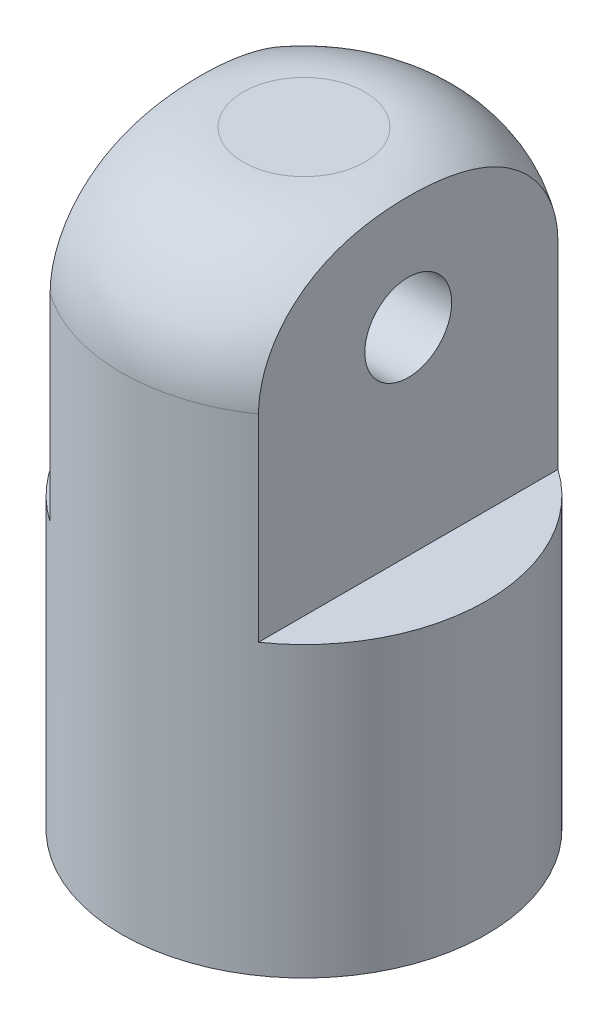
ISO-10303-21;
HEADER;
FILE_DESCRIPTION(('STEP AP214'),'2;1');
FILE_NAME('part.step','',(''),(''),'','','');
FILE_SCHEMA(('AUTOMOTIVE_DESIGN { 1 0 10303 214 1 1 1 1 }'));
ENDSEC;
DATA;
#1=APPLICATION_CONTEXT('core data for automotive mechanical design processes');
#2=APPLICATION_PROTOCOL_DEFINITION('international standard','automotive_design',2000,#1);
#3=PRODUCT_CONTEXT('',#1,'mechanical');
#4=PRODUCT('Part','Part','',(#3));
#5=PRODUCT_RELATED_PRODUCT_CATEGORY('part','',(#4));
#6=PRODUCT_DEFINITION_FORMATION('','',#4);
#7=PRODUCT_DEFINITION_CONTEXT('part definition',#1,'design');
#8=PRODUCT_DEFINITION('design','',#6,#7);
#9=PRODUCT_DEFINITION_SHAPE('','',#8);
#10=(LENGTH_UNIT() NAMED_UNIT(*) SI_UNIT(.MILLI.,.METRE.));
#11=(NAMED_UNIT(*) PLANE_ANGLE_UNIT() SI_UNIT($,.RADIAN.));
#12=(NAMED_UNIT(*) SI_UNIT($,.STERADIAN.) SOLID_ANGLE_UNIT());
#13=UNCERTAINTY_MEASURE_WITH_UNIT(LENGTH_MEASURE(1.E-05),#10,'distance_accuracy_value','');
#14=(GEOMETRIC_REPRESENTATION_CONTEXT(3) GLOBAL_UNCERTAINTY_ASSIGNED_CONTEXT((#13)) GLOBAL_UNIT_ASSIGNED_CONTEXT((#10,
#11,#12)) REPRESENTATION_CONTEXT('',''));
#15=CARTESIAN_POINT('',(0.,0.,0.));
#16=DIRECTION('',(0.,0.,1.));
#17=DIRECTION('',(1.,0.,0.));
#18=AXIS2_PLACEMENT_3D('',#15,#16,#17);
#19=CARTESIAN_POINT('',(0.,35.,0.));
#20=DIRECTION('',(0.,-1.,0.));
#21=DIRECTION('',(0.,0.,-1.));
#22=AXIS2_PLACEMENT_3D('',#19,#20,#21);
#23=CYLINDRICAL_SURFACE('',#22,10.5);
#24=CARTESIAN_POINT('',(0.,28.,0.));
#25=DIRECTION('',(0.,1.,0.));
#26=DIRECTION('',(0.,0.,1.));
#27=AXIS2_PLACEMENT_3D('',#24,#25,#26);
#28=CIRCLE('',#27,10.5);
#29=CARTESIAN_POINT('',(-6.,28.,-8.61684396980704));
#30=VERTEX_POINT('',#29);
#31=CARTESIAN_POINT('',(6.,28.,-8.61684396980704));
#32=VERTEX_POINT('',#31);
#33=EDGE_CURVE('E85',#30,#32,#28,.F.);
#34=ORIENTED_EDGE('',*,*,#33,.T.);
#35=DIRECTION('',(0.,-1.,0.));
#36=VECTOR('',#35,1.);
#37=CARTESIAN_POINT('',(6.,35.,-8.61684396980704));
#38=LINE('',#37,#36);
#39=CARTESIAN_POINT('',(6.,16.6235185130567,-8.61684396980704));
#40=VERTEX_POINT('',#39);
#41=EDGE_CURVE('E47',#32,#40,#38,.T.);
#42=ORIENTED_EDGE('',*,*,#41,.T.);
#43=CARTESIAN_POINT('',(0.,16.6235185130567,0.));
#44=DIRECTION('',(0.,-1.,0.));
#45=DIRECTION('',(0.,0.,-1.));
#46=AXIS2_PLACEMENT_3D('',#43,#44,#45);
#47=CIRCLE('',#46,10.5);
#48=CARTESIAN_POINT('',(6.,16.6235185130567,8.61684396980704));
#49=VERTEX_POINT('',#48);
#50=EDGE_CURVE('E11',#40,#49,#47,.T.);
#51=ORIENTED_EDGE('',*,*,#50,.T.);
#52=DIRECTION('',(0.,-1.,0.));
#53=VECTOR('',#52,1.);
#54=CARTESIAN_POINT('',(6.,35.,8.61684396980704));
#55=LINE('',#54,#53);
#56=CARTESIAN_POINT('',(6.,28.,8.61684396980704));
#57=VERTEX_POINT('',#56);
#58=EDGE_CURVE('E78',#49,#57,#55,.F.);
#59=ORIENTED_EDGE('',*,*,#58,.T.);
#60=CARTESIAN_POINT('',(-6.,28.,8.61684396980704));
#61=VERTEX_POINT('',#60);
#62=EDGE_CURVE('E55',#57,#61,#28,.F.);
#63=ORIENTED_EDGE('',*,*,#62,.T.);
#64=DIRECTION('',(0.,-1.,0.));
#65=VECTOR('',#64,1.);
#66=CARTESIAN_POINT('',(-6.,35.,8.61684396980704));
#67=LINE('',#66,#65);
#68=CARTESIAN_POINT('',(-6.,16.6235185130567,8.61684396980705));
#69=VERTEX_POINT('',#68);
#70=EDGE_CURVE('E94',#61,#69,#67,.T.);
#71=ORIENTED_EDGE('',*,*,#70,.T.);
#72=CARTESIAN_POINT('',(0.,16.6235185130567,0.));
#73=DIRECTION('',(0.,-1.,0.));
#74=DIRECTION('',(0.,0.,-1.));
#75=AXIS2_PLACEMENT_3D('',#72,#73,#74);
#76=CIRCLE('',#75,10.5);
#77=CARTESIAN_POINT('',(-6.,16.6235185130567,-8.61684396980705));
#78=VERTEX_POINT('',#77);
#79=EDGE_CURVE('E108',#69,#78,#76,.T.);
#80=ORIENTED_EDGE('',*,*,#79,.T.);
#81=DIRECTION('',(0.,-1.,0.));
#82=VECTOR('',#81,1.);
#83=CARTESIAN_POINT('',(-6.,35.,-8.61684396980704));
#84=LINE('',#83,#82);
#85=EDGE_CURVE('E89',#78,#30,#84,.F.);
#86=ORIENTED_EDGE('',*,*,#85,.T.);
#87=EDGE_LOOP('',(#34,#42,#51,#59,#63,#71,#80,#86));
#88=FACE_BOUND('',#87,.T.);
#89=CARTESIAN_POINT('',(0.,0.,0.));
#90=DIRECTION('',(0.,1.,0.));
#91=DIRECTION('',(0.,0.,1.));
#92=AXIS2_PLACEMENT_3D('',#89,#90,#91);
#93=CIRCLE('',#92,10.5);
#94=CARTESIAN_POINT('',(0.,0.,10.5));
#95=VERTEX_POINT('',#94);
#96=EDGE_CURVE('E96',#95,#95,#93,.T.);
#97=ORIENTED_EDGE('',*,*,#96,.T.);
#98=EDGE_LOOP('',(#97));
#99=FACE_BOUND('',#98,.T.);
#100=ADVANCED_FACE('F31',(#88,#99),#23,.T.);
#101=CARTESIAN_POINT('',(0.,35.,0.));
#102=DIRECTION('',(0.,1.,0.));
#103=DIRECTION('',(0.,0.,1.));
#104=AXIS2_PLACEMENT_3D('',#101,#102,#103);
#105=PLANE('',#104);
#106=CARTESIAN_POINT('',(0.,35.,0.));
#107=DIRECTION('',(0.,1.,0.));
#108=DIRECTION('',(0.,0.,1.));
#109=AXIS2_PLACEMENT_3D('',#106,#107,#108);
#110=CIRCLE('',#109,3.5);
#111=CARTESIAN_POINT('',(0.,35.,3.5));
#112=VERTEX_POINT('',#111);
#113=EDGE_CURVE('E99',#112,#112,#110,.T.);
#114=ORIENTED_EDGE('',*,*,#113,.T.);
#115=EDGE_LOOP('',(#114));
#116=FACE_BOUND('',#115,.T.);
#117=ADVANCED_FACE('F121',(#116),#105,.T.);
#118=CARTESIAN_POINT('',(0.,0.,0.));
#119=DIRECTION('',(0.,1.,0.));
#120=DIRECTION('',(0.,0.,1.));
#121=AXIS2_PLACEMENT_3D('',#118,#119,#120);
#122=PLANE('',#121);
#123=ORIENTED_EDGE('',*,*,#96,.F.);
#124=EDGE_LOOP('',(#123));
#125=FACE_BOUND('',#124,.T.);
#126=ADVANCED_FACE('F124',(#125),#122,.F.);
#127=CARTESIAN_POINT('',(0.,28.,0.));
#128=DIRECTION('',(0.,1.,0.));
#129=DIRECTION('',(0.,0.,1.));
#130=AXIS2_PLACEMENT_3D('',#127,#128,#129);
#131=DEGENERATE_TOROIDAL_SURFACE('',#130,3.5,7.,.T.);
#132=CARTESIAN_POINT('',(6.,34.538348415311,0.));
#133=CARTESIAN_POINT('',(6.,34.5383470476797,0.186580885059459));
#134=CARTESIAN_POINT('',(6.,34.535031612828,0.373158833971555));
#135=CARTESIAN_POINT('',(6.,34.5216316319683,0.746086476739765));
#136=CARTESIAN_POINT('',(6.,34.5115466426671,0.932436154847296));
#137=CARTESIAN_POINT('',(6.,34.4842105567304,1.30471851506696));
#138=CARTESIAN_POINT('',(6.,34.4669558593029,1.49065094038404));
#139=CARTESIAN_POINT('',(6.,34.4246868345988,1.86163039115523));
#140=CARTESIAN_POINT('',(6.,34.3996716059039,2.04667731121748));
#141=CARTESIAN_POINT('',(6.,34.3121171689303,2.59820711107407));
#142=CARTESIAN_POINT('',(6.,34.2369502966413,2.96289089226654));
#143=CARTESIAN_POINT('',(6.,34.0942460748687,3.50166123222229));
#144=CARTESIAN_POINT('',(6.,34.0417143056704,3.67980164502698));
#145=CARTESIAN_POINT('',(6.,33.9259403920513,4.03255459453971));
#146=CARTESIAN_POINT('',(6.,33.862700981253,4.20716801897197));
#147=CARTESIAN_POINT('',(6.,33.7210575357549,4.56150227960769));
#148=CARTESIAN_POINT('',(6.,33.6420045957356,4.74096509221903));
#149=CARTESIAN_POINT('',(6.,33.4707686597631,5.0935216820569));
#150=CARTESIAN_POINT('',(6.,33.3785867732366,5.26661599588293));
#151=CARTESIAN_POINT('',(6.,33.1808149449077,5.6049862297444));
#152=CARTESIAN_POINT('',(6.,33.0752255271332,5.77026245500043));
#153=CARTESIAN_POINT('',(6.,32.8506256537885,6.09145896378113));
#154=CARTESIAN_POINT('',(6.,32.7316150620613,6.24737915236483));
#155=CARTESIAN_POINT('',(6.,32.4795291168691,6.54937076951004));
#156=CARTESIAN_POINT('',(6.,32.3463574545955,6.69536201465493));
#157=CARTESIAN_POINT('',(6.,32.0672613694259,6.97459919050036));
#158=CARTESIAN_POINT('',(6.,31.9213381332272,7.10784630479359));
#159=CARTESIAN_POINT('',(6.,31.6176024616835,7.36003212125638));
#160=CARTESIAN_POINT('',(6.,31.4597904965536,7.47897138883793));
#161=CARTESIAN_POINT('',(6.,31.1334245575168,7.70106456192392));
#162=CARTESIAN_POINT('',(6.,30.9648717691818,7.80422020536423));
#163=CARTESIAN_POINT('',(6.,30.6353268964471,7.98419581299614));
#164=CARTESIAN_POINT('',(6.,30.4751998674173,8.06260286268284));
#165=CARTESIAN_POINT('',(6.,30.1485259550906,8.20463965566976));
#166=CARTESIAN_POINT('',(6.,29.9819796922651,8.26827082302393));
#167=CARTESIAN_POINT('',(6.,29.6438383276663,8.38003485170386));
#168=CARTESIAN_POINT('',(6.,29.4722453042928,8.42817399818534));
#169=CARTESIAN_POINT('',(6.,29.1253559364917,8.50844769539919));
#170=CARTESIAN_POINT('',(6.,28.9500597721605,8.54058302259241));
#171=CARTESIAN_POINT('',(6.,28.6103808292943,8.58670497948734));
#172=CARTESIAN_POINT('',(6.,28.4461561513686,8.60186375295892));
#173=CARTESIAN_POINT('',(6.,28.1169538077274,8.61801709991111));
#174=CARTESIAN_POINT('',(6.,27.9519759148595,8.61900707330178));
#175=CARTESIAN_POINT('',(6.,27.6226343232526,8.60680334136019));
#176=CARTESIAN_POINT('',(6.,27.4582703468047,8.59361710564905));
#177=CARTESIAN_POINT('',(6.,27.1312173604918,8.55319441432273));
#178=CARTESIAN_POINT('',(6.,26.9685289969287,8.52595273018649));
#179=CARTESIAN_POINT('',(6.,26.6491507057037,8.45833395627727));
#180=CARTESIAN_POINT('',(6.,26.4924055508438,8.41821719158695));
#181=CARTESIAN_POINT('',(6.,26.1827289011938,8.32507062346714));
#182=CARTESIAN_POINT('',(6.,26.0297990784365,8.27203526448678));
#183=CARTESIAN_POINT('',(6.,25.7288836376565,8.15356717093942));
#184=CARTESIAN_POINT('',(6.,25.5808963575713,8.0881386543009));
#185=CARTESIAN_POINT('',(6.,25.2907333848672,7.94545902538857));
#186=CARTESIAN_POINT('',(6.,25.1485579570097,7.86820737526568));
#187=CARTESIAN_POINT('',(6.,24.8677430296865,7.70070350576959));
#188=CARTESIAN_POINT('',(6.,24.7292543299059,7.61019858811677));
#189=CARTESIAN_POINT('',(6.,24.460048257379,7.41837927558068));
#190=CARTESIAN_POINT('',(6.,24.3293286481399,7.31706801522583));
#191=CARTESIAN_POINT('',(6.,24.0761783674013,7.10441586154709));
#192=CARTESIAN_POINT('',(6.,23.9537533527454,6.99306824174949));
#193=CARTESIAN_POINT('',(6.,23.7178312132029,6.76135482316139));
#194=CARTESIAN_POINT('',(6.,23.6043320035852,6.64099114308199));
#195=CARTESIAN_POINT('',(6.,23.3790072171889,6.38349474205575));
#196=CARTESIAN_POINT('',(6.,23.2678492541923,6.24577795638685));
#197=CARTESIAN_POINT('',(6.,23.056404149593,5.96225552149716));
#198=CARTESIAN_POINT('',(6.,22.9561172108438,5.81644972141191));
#199=CARTESIAN_POINT('',(6.,22.7665865204061,5.51804899194059));
#200=CARTESIAN_POINT('',(6.,22.677331724394,5.36546106374249));
#201=CARTESIAN_POINT('',(6.,22.5096294560222,5.0544467438311));
#202=CARTESIAN_POINT('',(6.,22.4311842585074,4.89601913203971));
#203=CARTESIAN_POINT('',(6.,22.2470827517565,4.49135225554522));
#204=CARTESIAN_POINT('',(6.,22.1482689622811,4.24198018357643));
#205=CARTESIAN_POINT('',(6.,21.973317032721,3.73540836880231));
#206=CARTESIAN_POINT('',(6.,21.8971889432407,3.47820521198973));
#207=CARTESIAN_POINT('',(6.,21.7650692762856,2.95711187155706));
#208=CARTESIAN_POINT('',(6.,21.7092005301741,2.69319094999168));
#209=CARTESIAN_POINT('',(6.,21.6157756459416,2.16218231670984));
#210=CARTESIAN_POINT('',(6.,21.5782197790966,1.89509455814178));
#211=CARTESIAN_POINT('',(6.,21.5258459395111,1.41990404679869));
#212=CARTESIAN_POINT('',(6.,21.5078045713599,1.21214299101859));
#213=CARTESIAN_POINT('',(6.,21.4805293061332,0.796021228875646));
#214=CARTESIAN_POINT('',(6.,21.471296471213,0.58766045323467));
#215=CARTESIAN_POINT('',(6.,21.4611813450314,0.170542649874067));
#216=CARTESIAN_POINT('',(6.,21.4603069968236,-0.0382145662395018));
#217=CARTESIAN_POINT('',(6.,21.4668838261679,-0.455587157397281));
#218=CARTESIAN_POINT('',(6.,21.4743345975712,-0.664202538864227));
#219=CARTESIAN_POINT('',(6.,21.4978890357739,-1.08011321487968));
#220=CARTESIAN_POINT('',(6.,21.5139573843598,-1.28741042746345));
#221=CARTESIAN_POINT('',(6.,21.5554420314481,-1.70104900547415));
#222=CARTESIAN_POINT('',(6.,21.5808589644067,-1.9073903050639));
#223=CARTESIAN_POINT('',(6.,21.6725371352318,-2.52359209093716));
#224=CARTESIAN_POINT('',(6.,21.7542642406613,-2.93144142922276));
#225=CARTESIAN_POINT('',(6.,21.9151149028473,-3.53609648618851));
#226=CARTESIAN_POINT('',(6.,21.9757020367475,-3.73792640747409));
#227=CARTESIAN_POINT('',(6.,22.1108166424432,-4.13691985229828));
#228=CARTESIAN_POINT('',(6.,22.1853438119163,-4.3340834769321));
#229=CARTESIAN_POINT('',(6.,22.3490557994567,-4.72193783996171));
#230=CARTESIAN_POINT('',(6.,22.4382203556282,-4.91263709253501));
#231=CARTESIAN_POINT('',(6.,22.631832639714,-5.2861502597584));
#232=CARTESIAN_POINT('',(6.,22.7362803463899,-5.46896418536599));
#233=CARTESIAN_POINT('',(6.,22.961826471654,-5.82667409655229));
#234=CARTESIAN_POINT('',(6.,23.0830842003962,-6.0014700265969));
#235=CARTESIAN_POINT('',(6.,23.3412735035322,-6.33912329973631));
#236=CARTESIAN_POINT('',(6.,23.4782056111503,-6.50198023637098));
#237=CARTESIAN_POINT('',(6.,23.7672377783909,-6.81376581028696));
#238=CARTESIAN_POINT('',(6.,23.9193430532273,-6.96268962425406));
#239=CARTESIAN_POINT('',(6.,24.2377236971245,-7.24453333540423));
#240=CARTESIAN_POINT('',(6.,24.4039969066427,-7.37745566418245));
#241=CARTESIAN_POINT('',(6.,24.7286540487555,-7.61054643765993));
#242=CARTESIAN_POINT('',(6.,24.8855933150901,-7.7127311870653));
#243=CARTESIAN_POINT('',(6.,25.2082786054022,-7.90208966608787));
#244=CARTESIAN_POINT('',(6.,25.3740236846807,-7.9892650016959));
#245=CARTESIAN_POINT('',(6.,25.7128894666211,-8.14752399707165));
#246=CARTESIAN_POINT('',(6.,25.8860049250296,-8.21861887851039));
#247=CARTESIAN_POINT('',(6.,26.2382391386186,-8.34393146739957));
#248=CARTESIAN_POINT('',(6.,26.4173574104796,-8.39815053001607));
#249=CARTESIAN_POINT('',(6.,26.7612576873963,-8.48435469222224));
#250=CARTESIAN_POINT('',(6.,26.9256114762003,-8.51805692316374));
#251=CARTESIAN_POINT('',(6.,27.2566257501583,-8.57102103121931));
#252=CARTESIAN_POINT('',(6.,27.423286079016,-8.59028388194618));
#253=CARTESIAN_POINT('',(6.,27.757615714351,-8.61417279716831));
#254=CARTESIAN_POINT('',(6.,27.9252847980595,-8.61880198242639));
#255=CARTESIAN_POINT('',(6.,28.2603869411644,-8.61338558185795));
#256=CARTESIAN_POINT('',(6.,28.4278200015056,-8.60334005494263));
#257=CARTESIAN_POINT('',(6.,28.7554737680412,-8.56926946656343));
#258=CARTESIAN_POINT('',(6.,28.9157455707131,-8.54573331727795));
#259=CARTESIAN_POINT('',(6.,29.2338007019116,-8.48527950070916));
#260=CARTESIAN_POINT('',(6.,29.3915831760014,-8.44835733878338));
#261=CARTESIAN_POINT('',(6.,29.7034405705524,-8.36149828180089));
#262=CARTESIAN_POINT('',(6.,29.8575172032367,-8.31156752842386));
#263=CARTESIAN_POINT('',(6.,30.1610799072176,-8.19911890776889));
#264=CARTESIAN_POINT('',(6.,30.3105639172999,-8.13659548120858));
#265=CARTESIAN_POINT('',(6.,30.6053433080639,-7.99887596099465));
#266=CARTESIAN_POINT('',(6.,30.7505839039593,-7.9235626796401));
#267=CARTESIAN_POINT('',(6.,31.0344605120356,-7.76137301227181));
#268=CARTESIAN_POINT('',(6.,31.1730962003182,-7.67449605997782));
#269=CARTESIAN_POINT('',(6.,31.4430013065236,-7.48993029520538));
#270=CARTESIAN_POINT('',(6.,31.5742694358294,-7.39223960018417));
#271=CARTESIAN_POINT('',(6.,31.828719807031,-7.1869200290056));
#272=CARTESIAN_POINT('',(6.,31.9519041289679,-7.07929372666559));
#273=CARTESIAN_POINT('',(6.,32.1959882850562,-6.84902419316991));
#274=CARTESIAN_POINT('',(6.,32.316422745229,-6.72588779539327));
#275=CARTESIAN_POINT('',(6.,32.5473244640053,-6.47061677134737));
#276=CARTESIAN_POINT('',(6.,32.6577916268258,-6.33848205862806));
#277=CARTESIAN_POINT('',(6.,32.868495321218,-6.06626506125714));
#278=CARTESIAN_POINT('',(6.,32.9687299477255,-5.92618130420092));
#279=CARTESIAN_POINT('',(6.,33.1588438174547,-5.63914411099166));
#280=CARTESIAN_POINT('',(6.,33.2487210660915,-5.4921893592824));
#281=CARTESIAN_POINT('',(6.,33.4523950045808,-5.13186861216753));
#282=CARTESIAN_POINT('',(6.,33.5611851465555,-4.91565848265422));
#283=CARTESIAN_POINT('',(6.,33.7590636548106,-4.47439981242773));
#284=CARTESIAN_POINT('',(6.,33.8481449367445,-4.24934812773683));
#285=CARTESIAN_POINT('',(6.,34.0078239412462,-3.79263557790706));
#286=CARTESIAN_POINT('',(6.,34.0784073084903,-3.5609697335372));
#287=CARTESIAN_POINT('',(6.,34.2025824148097,-3.09312433995413));
#288=CARTESIAN_POINT('',(6.,34.2561703832541,-2.85694380140861));
#289=CARTESIAN_POINT('',(6.,34.343773293085,-2.40405363199883));
#290=CARTESIAN_POINT('',(6.,34.3791557743447,-2.18760372642594));
#291=CARTESIAN_POINT('',(6.,34.4386942450028,-1.7532030285663));
#292=CARTESIAN_POINT('',(6.,34.4628512072191,-1.53525236799882));
#293=CARTESIAN_POINT('',(6.,34.5010733197104,-1.09797012762912));
#294=CARTESIAN_POINT('',(6.,34.5151146997011,-0.878636509068205));
#295=CARTESIAN_POINT('',(6.,34.5337539032118,-0.43953395003534));
#296=CARTESIAN_POINT('',(6.,34.5383500261802,-0.21976493830218));
#297=CARTESIAN_POINT('',(6.,34.538348415311,0.));
#298=B_SPLINE_CURVE_WITH_KNOTS('',3,(#132,#133,#134,#135,#136,#137,#138,#139,#140,#141,#142,
#143,#144,#145,#146,#147,#148,#149,#150,#151,#152,#153,#154,#155,#156,#157,#158,#159,#160,#161,
#162,#163,#164,#165,#166,#167,#168,#169,#170,#171,#172,#173,#174,#175,#176,#177,#178,#179,#180,
#181,#182,#183,#184,#185,#186,#187,#188,#189,#190,#191,#192,#193,#194,#195,#196,#197,#198,#199,
#200,#201,#202,#203,#204,#205,#206,#207,#208,#209,#210,#211,#212,#213,#214,#215,#216,#217,#218,
#219,#220,#221,#222,#223,#224,#225,#226,#227,#228,#229,#230,#231,#232,#233,#234,#235,#236,#237,
#238,#239,#240,#241,#242,#243,#244,#245,#246,#247,#248,#249,#250,#251,#252,#253,#254,#255,#256,
#257,#258,#259,#260,#261,#262,#263,#264,#265,#266,#267,#268,#269,#270,#271,#272,#273,#274,#275,
#276,#277,#278,#279,#280,#281,#282,#283,#284,#285,#286,#287,#288,#289,#290,#291,#292,#293,#294,
#295,#296,#297),.UNSPECIFIED.,.T.,.F.,(4,2,2,2,2,2,2,2,2,2,2,2,2,2,2,2,2,2,2,2,2,2,2,2,2,2,2,2,
2,2,2,2,2,2,2,2,2,2,2,2,2,2,2,2,2,2,2,2,2,2,2,2,2,2,2,2,2,2,2,2,2,2,2,2,2,2,2,2,2,2,2,2,2,2,2,2,
2,2,2,2,2,2,4),(0.,0.559706185938889,1.11944902689943,1.67947332397216,2.23956269457168,
3.35431071351508,3.91121249417814,4.46797231359636,5.05577352272967,5.64352509071895,
6.23125369373545,6.81898825975655,7.41101224504284,8.00298119345879,8.5949267409835,
9.18680706236785,9.72098094549099,10.2551033251961,10.789008735993,11.3228882406583,
11.8170566442499,12.3113854825673,12.8054539804657,13.299706400779,13.7845360059541,
14.269574477944,14.7544481659833,15.2393439180913,15.7351139085981,16.2307404832583,
16.7267017376881,17.2225468081256,17.7529401535332,18.2833433943892,18.8132112700978,
19.3431904850355,20.1466088851244,20.9503827019036,21.7589513479829,22.5675319713522,
23.1929743279419,23.8184920924283,24.4446042262075,25.0706858158523,25.6942208695209,
26.3177982481811,27.5625259627722,28.1943011773291,28.8260626919381,29.4569569488496,
30.087850329038,30.7251935812002,31.3625585214914,32.0001432921712,32.6376310524609,
33.1986791423393,33.7596671633288,34.3202624851911,34.8808127783715,35.3835126368049,
35.8861785963417,36.3887373505373,36.8912940872312,37.3766955104566,37.8622600688555,
38.3475957942715,38.8331462521596,39.3234127215341,39.8137032084055,40.3040791835993,
40.794328481554,41.310505704304,41.8266878868545,42.3429659961343,42.8593433627539,
43.5843435165198,44.309603849613,45.0354253660494,45.7614078021421,46.4190577426405,
47.0766506797022,47.7357838773152,48.3950357368023),.UNSPECIFIED.);
#299=EDGE_CURVE('E40',#32,#57,#298,.T.);
#300=ORIENTED_EDGE('',*,*,#299,.F.);
#301=ORIENTED_EDGE('',*,*,#33,.F.);
#302=CARTESIAN_POINT('',(-6.,34.538348415311,0.));
#303=CARTESIAN_POINT('',(-6.,34.5383470476797,-0.186580885059459));
#304=CARTESIAN_POINT('',(-6.,34.535031612828,-0.373158833971555));
#305=CARTESIAN_POINT('',(-6.,34.5216316319683,-0.746086476739765));
#306=CARTESIAN_POINT('',(-6.,34.5115466426671,-0.932436154847296));
#307=CARTESIAN_POINT('',(-6.,34.4842105567304,-1.30471851506696));
#308=CARTESIAN_POINT('',(-6.,34.4669558593029,-1.49065094038404));
#309=CARTESIAN_POINT('',(-6.,34.4246868345988,-1.86163039115523));
#310=CARTESIAN_POINT('',(-6.,34.3996716059039,-2.04667731121748));
#311=CARTESIAN_POINT('',(-6.,34.3121171689303,-2.59820711107407));
#312=CARTESIAN_POINT('',(-6.,34.2369502966413,-2.96289089226654));
#313=CARTESIAN_POINT('',(-6.,34.0942460748687,-3.50166123222229));
#314=CARTESIAN_POINT('',(-6.,34.0417143056704,-3.67980164502698));
#315=CARTESIAN_POINT('',(-6.,33.9259403920513,-4.03255459453971));
#316=CARTESIAN_POINT('',(-6.,33.862700981253,-4.20716801897197));
#317=CARTESIAN_POINT('',(-6.,33.7210575357549,-4.56150227960769));
#318=CARTESIAN_POINT('',(-6.,33.6420045957356,-4.74096509221903));
#319=CARTESIAN_POINT('',(-6.,33.4707686597631,-5.0935216820569));
#320=CARTESIAN_POINT('',(-6.,33.3785867732366,-5.26661599588293));
#321=CARTESIAN_POINT('',(-6.,33.1808149449077,-5.6049862297444));
#322=CARTESIAN_POINT('',(-6.,33.0752255271332,-5.77026245500043));
#323=CARTESIAN_POINT('',(-6.,32.8506256537885,-6.09145896378113));
#324=CARTESIAN_POINT('',(-6.,32.7316150620613,-6.24737915236483));
#325=CARTESIAN_POINT('',(-6.,32.4795291168691,-6.54937076951004));
#326=CARTESIAN_POINT('',(-6.,32.3463574545955,-6.69536201465493));
#327=CARTESIAN_POINT('',(-6.,32.0672613694259,-6.97459919050036));
#328=CARTESIAN_POINT('',(-6.,31.9213381332272,-7.10784630479359));
#329=CARTESIAN_POINT('',(-6.,31.6176024616835,-7.36003212125638));
#330=CARTESIAN_POINT('',(-6.,31.4597904965536,-7.47897138883793));
#331=CARTESIAN_POINT('',(-6.,31.1334245575168,-7.70106456192392));
#332=CARTESIAN_POINT('',(-6.,30.9648717691818,-7.80422020536423));
#333=CARTESIAN_POINT('',(-6.,30.6353268964471,-7.98419581299614));
#334=CARTESIAN_POINT('',(-6.,30.4751998674173,-8.06260286268284));
#335=CARTESIAN_POINT('',(-6.,30.1485259550906,-8.20463965566976));
#336=CARTESIAN_POINT('',(-6.,29.9819796922651,-8.26827082302393));
#337=CARTESIAN_POINT('',(-6.,29.6438383276663,-8.38003485170386));
#338=CARTESIAN_POINT('',(-6.,29.4722453042928,-8.42817399818534));
#339=CARTESIAN_POINT('',(-6.,29.1253559364917,-8.50844769539919));
#340=CARTESIAN_POINT('',(-6.,28.9500597721605,-8.54058302259241));
#341=CARTESIAN_POINT('',(-6.,28.6103808292943,-8.58670497948734));
#342=CARTESIAN_POINT('',(-6.,28.4461561513686,-8.60186375295892));
#343=CARTESIAN_POINT('',(-6.,28.1169538077274,-8.61801709991111));
#344=CARTESIAN_POINT('',(-6.,27.9519759148595,-8.61900707330178));
#345=CARTESIAN_POINT('',(-6.,27.6226343232526,-8.60680334136019));
#346=CARTESIAN_POINT('',(-6.,27.4582703468047,-8.59361710564905));
#347=CARTESIAN_POINT('',(-6.,27.1312173604918,-8.55319441432273));
#348=CARTESIAN_POINT('',(-6.,26.9685289969287,-8.52595273018649));
#349=CARTESIAN_POINT('',(-6.,26.6491507057037,-8.45833395627727));
#350=CARTESIAN_POINT('',(-6.,26.4924055508438,-8.41821719158695));
#351=CARTESIAN_POINT('',(-6.,26.1827289011938,-8.32507062346714));
#352=CARTESIAN_POINT('',(-6.,26.0297990784365,-8.27203526448678));
#353=CARTESIAN_POINT('',(-6.,25.7288836376565,-8.15356717093942));
#354=CARTESIAN_POINT('',(-6.,25.5808963575713,-8.0881386543009));
#355=CARTESIAN_POINT('',(-6.,25.2907333848672,-7.94545902538857));
#356=CARTESIAN_POINT('',(-6.,25.1485579570097,-7.86820737526568));
#357=CARTESIAN_POINT('',(-6.,24.8677430296865,-7.70070350576959));
#358=CARTESIAN_POINT('',(-6.,24.7292543299059,-7.61019858811677));
#359=CARTESIAN_POINT('',(-6.,24.460048257379,-7.41837927558068));
#360=CARTESIAN_POINT('',(-6.,24.3293286481399,-7.31706801522583));
#361=CARTESIAN_POINT('',(-6.,24.0761783674013,-7.10441586154709));
#362=CARTESIAN_POINT('',(-6.,23.9537533527454,-6.99306824174949));
#363=CARTESIAN_POINT('',(-6.,23.7178312132029,-6.76135482316139));
#364=CARTESIAN_POINT('',(-6.,23.6043320035852,-6.64099114308199));
#365=CARTESIAN_POINT('',(-6.,23.3790072171889,-6.38349474205575));
#366=CARTESIAN_POINT('',(-6.,23.2678492541923,-6.24577795638685));
#367=CARTESIAN_POINT('',(-6.,23.056404149593,-5.96225552149716));
#368=CARTESIAN_POINT('',(-6.,22.9561172108438,-5.81644972141191));
#369=CARTESIAN_POINT('',(-6.,22.7665865204061,-5.51804899194059));
#370=CARTESIAN_POINT('',(-6.,22.677331724394,-5.36546106374249));
#371=CARTESIAN_POINT('',(-6.,22.5096294560222,-5.0544467438311));
#372=CARTESIAN_POINT('',(-6.,22.4311842585074,-4.89601913203971));
#373=CARTESIAN_POINT('',(-6.,22.2470827517565,-4.49135225554522));
#374=CARTESIAN_POINT('',(-6.,22.1482689622811,-4.24198018357643));
#375=CARTESIAN_POINT('',(-6.,21.973317032721,-3.73540836880231));
#376=CARTESIAN_POINT('',(-6.,21.8971889432407,-3.47820521198973));
#377=CARTESIAN_POINT('',(-6.,21.7650692762856,-2.95711187155706));
#378=CARTESIAN_POINT('',(-6.,21.7092005301741,-2.69319094999168));
#379=CARTESIAN_POINT('',(-6.,21.6157756459416,-2.16218231670984));
#380=CARTESIAN_POINT('',(-6.,21.5782197790966,-1.89509455814178));
#381=CARTESIAN_POINT('',(-6.,21.5258459395111,-1.41990404679869));
#382=CARTESIAN_POINT('',(-6.,21.5078045713599,-1.21214299101859));
#383=CARTESIAN_POINT('',(-6.,21.4805293061332,-0.796021228875646));
#384=CARTESIAN_POINT('',(-6.,21.471296471213,-0.58766045323467));
#385=CARTESIAN_POINT('',(-6.,21.4611813450314,-0.170542649874067));
#386=CARTESIAN_POINT('',(-6.,21.4603069968236,0.0382145662395018));
#387=CARTESIAN_POINT('',(-6.,21.4668838261679,0.455587157397281));
#388=CARTESIAN_POINT('',(-6.,21.4743345975712,0.664202538864227));
#389=CARTESIAN_POINT('',(-6.,21.4978890357739,1.08011321487968));
#390=CARTESIAN_POINT('',(-6.,21.5139573843598,1.28741042746345));
#391=CARTESIAN_POINT('',(-6.,21.5554420314481,1.70104900547415));
#392=CARTESIAN_POINT('',(-6.,21.5808589644067,1.9073903050639));
#393=CARTESIAN_POINT('',(-6.,21.6725371352318,2.52359209093716));
#394=CARTESIAN_POINT('',(-6.,21.7542642406613,2.93144142922276));
#395=CARTESIAN_POINT('',(-6.,21.9151149028473,3.53609648618851));
#396=CARTESIAN_POINT('',(-6.,21.9757020367475,3.73792640747409));
#397=CARTESIAN_POINT('',(-6.,22.1108166424432,4.13691985229828));
#398=CARTESIAN_POINT('',(-6.,22.1853438119163,4.3340834769321));
#399=CARTESIAN_POINT('',(-6.,22.3490557994567,4.72193783996171));
#400=CARTESIAN_POINT('',(-6.,22.4382203556282,4.91263709253501));
#401=CARTESIAN_POINT('',(-6.,22.631832639714,5.2861502597584));
#402=CARTESIAN_POINT('',(-6.,22.7362803463899,5.46896418536599));
#403=CARTESIAN_POINT('',(-6.,22.961826471654,5.82667409655229));
#404=CARTESIAN_POINT('',(-6.,23.0830842003962,6.0014700265969));
#405=CARTESIAN_POINT('',(-6.,23.3412735035322,6.33912329973631));
#406=CARTESIAN_POINT('',(-6.,23.4782056111503,6.50198023637098));
#407=CARTESIAN_POINT('',(-6.,23.7672377783909,6.81376581028696));
#408=CARTESIAN_POINT('',(-6.,23.9193430532273,6.96268962425406));
#409=CARTESIAN_POINT('',(-6.,24.2377236971245,7.24453333540423));
#410=CARTESIAN_POINT('',(-6.,24.4039969066427,7.37745566418245));
#411=CARTESIAN_POINT('',(-6.,24.7286540487555,7.61054643765993));
#412=CARTESIAN_POINT('',(-6.,24.8855933150901,7.7127311870653));
#413=CARTESIAN_POINT('',(-6.,25.2082786054022,7.90208966608787));
#414=CARTESIAN_POINT('',(-6.,25.3740236846807,7.9892650016959));
#415=CARTESIAN_POINT('',(-6.,25.7128894666211,8.14752399707165));
#416=CARTESIAN_POINT('',(-6.,25.8860049250296,8.21861887851039));
#417=CARTESIAN_POINT('',(-6.,26.2382391386186,8.34393146739957));
#418=CARTESIAN_POINT('',(-6.,26.4173574104796,8.39815053001607));
#419=CARTESIAN_POINT('',(-6.,26.7612576873963,8.48435469222224));
#420=CARTESIAN_POINT('',(-6.,26.9256114762003,8.51805692316374));
#421=CARTESIAN_POINT('',(-6.,27.2566257501583,8.57102103121931));
#422=CARTESIAN_POINT('',(-6.,27.423286079016,8.59028388194618));
#423=CARTESIAN_POINT('',(-6.,27.757615714351,8.61417279716831));
#424=CARTESIAN_POINT('',(-6.,27.9252847980595,8.61880198242639));
#425=CARTESIAN_POINT('',(-6.,28.2603869411644,8.61338558185795));
#426=CARTESIAN_POINT('',(-6.,28.4278200015056,8.60334005494263));
#427=CARTESIAN_POINT('',(-6.,28.7554737680412,8.56926946656343));
#428=CARTESIAN_POINT('',(-6.,28.9157455707131,8.54573331727795));
#429=CARTESIAN_POINT('',(-6.,29.2338007019116,8.48527950070916));
#430=CARTESIAN_POINT('',(-6.,29.3915831760014,8.44835733878338));
#431=CARTESIAN_POINT('',(-6.,29.7034405705524,8.36149828180089));
#432=CARTESIAN_POINT('',(-6.,29.8575172032367,8.31156752842386));
#433=CARTESIAN_POINT('',(-6.,30.1610799072176,8.19911890776889));
#434=CARTESIAN_POINT('',(-6.,30.3105639172999,8.13659548120858));
#435=CARTESIAN_POINT('',(-6.,30.6053433080639,7.99887596099465));
#436=CARTESIAN_POINT('',(-6.,30.7505839039593,7.9235626796401));
#437=CARTESIAN_POINT('',(-6.,31.0344605120356,7.76137301227181));
#438=CARTESIAN_POINT('',(-6.,31.1730962003182,7.67449605997782));
#439=CARTESIAN_POINT('',(-6.,31.4430013065236,7.48993029520538));
#440=CARTESIAN_POINT('',(-6.,31.5742694358294,7.39223960018417));
#441=CARTESIAN_POINT('',(-6.,31.828719807031,7.1869200290056));
#442=CARTESIAN_POINT('',(-6.,31.9519041289679,7.07929372666559));
#443=CARTESIAN_POINT('',(-6.,32.1959882850562,6.84902419316991));
#444=CARTESIAN_POINT('',(-6.,32.316422745229,6.72588779539327));
#445=CARTESIAN_POINT('',(-6.,32.5473244640053,6.47061677134737));
#446=CARTESIAN_POINT('',(-6.,32.6577916268258,6.33848205862806));
#447=CARTESIAN_POINT('',(-6.,32.868495321218,6.06626506125714));
#448=CARTESIAN_POINT('',(-6.,32.9687299477255,5.92618130420092));
#449=CARTESIAN_POINT('',(-6.,33.1588438174547,5.63914411099166));
#450=CARTESIAN_POINT('',(-6.,33.2487210660915,5.4921893592824));
#451=CARTESIAN_POINT('',(-6.,33.4523950045808,5.13186861216753));
#452=CARTESIAN_POINT('',(-6.,33.5611851465555,4.91565848265422));
#453=CARTESIAN_POINT('',(-6.,33.7590636548106,4.47439981242773));
#454=CARTESIAN_POINT('',(-6.,33.8481449367445,4.24934812773683));
#455=CARTESIAN_POINT('',(-6.,34.0078239412462,3.79263557790706));
#456=CARTESIAN_POINT('',(-6.,34.0784073084903,3.5609697335372));
#457=CARTESIAN_POINT('',(-6.,34.2025824148097,3.09312433995413));
#458=CARTESIAN_POINT('',(-6.,34.2561703832541,2.85694380140861));
#459=CARTESIAN_POINT('',(-6.,34.343773293085,2.40405363199883));
#460=CARTESIAN_POINT('',(-6.,34.3791557743447,2.18760372642594));
#461=CARTESIAN_POINT('',(-6.,34.4386942450028,1.7532030285663));
#462=CARTESIAN_POINT('',(-6.,34.4628512072191,1.53525236799882));
#463=CARTESIAN_POINT('',(-6.,34.5010733197104,1.09797012762912));
#464=CARTESIAN_POINT('',(-6.,34.5151146997011,0.878636509068205));
#465=CARTESIAN_POINT('',(-6.,34.5337539032118,0.43953395003534));
#466=CARTESIAN_POINT('',(-6.,34.5383500261802,0.21976493830218));
#467=CARTESIAN_POINT('',(-6.,34.538348415311,0.));
#468=B_SPLINE_CURVE_WITH_KNOTS('',3,(#302,#303,#304,#305,#306,#307,#308,#309,#310,#311,#312,
#313,#314,#315,#316,#317,#318,#319,#320,#321,#322,#323,#324,#325,#326,#327,#328,#329,#330,#331,
#332,#333,#334,#335,#336,#337,#338,#339,#340,#341,#342,#343,#344,#345,#346,#347,#348,#349,#350,
#351,#352,#353,#354,#355,#356,#357,#358,#359,#360,#361,#362,#363,#364,#365,#366,#367,#368,#369,
#370,#371,#372,#373,#374,#375,#376,#377,#378,#379,#380,#381,#382,#383,#384,#385,#386,#387,#388,
#389,#390,#391,#392,#393,#394,#395,#396,#397,#398,#399,#400,#401,#402,#403,#404,#405,#406,#407,
#408,#409,#410,#411,#412,#413,#414,#415,#416,#417,#418,#419,#420,#421,#422,#423,#424,#425,#426,
#427,#428,#429,#430,#431,#432,#433,#434,#435,#436,#437,#438,#439,#440,#441,#442,#443,#444,#445,
#446,#447,#448,#449,#450,#451,#452,#453,#454,#455,#456,#457,#458,#459,#460,#461,#462,#463,#464,
#465,#466,#467),.UNSPECIFIED.,.T.,.F.,(4,2,2,2,2,2,2,2,2,2,2,2,2,2,2,2,2,2,2,2,2,2,2,2,2,2,2,2,
2,2,2,2,2,2,2,2,2,2,2,2,2,2,2,2,2,2,2,2,2,2,2,2,2,2,2,2,2,2,2,2,2,2,2,2,2,2,2,2,2,2,2,2,2,2,2,2,
2,2,2,2,2,2,4),(0.,0.559706185938889,1.11944902689943,1.67947332397216,2.23956269457168,
3.35431071351508,3.91121249417814,4.46797231359636,5.05577352272967,5.64352509071895,
6.23125369373545,6.81898825975655,7.41101224504284,8.00298119345879,8.5949267409835,
9.18680706236785,9.72098094549099,10.2551033251961,10.789008735993,11.3228882406583,
11.8170566442499,12.3113854825673,12.8054539804657,13.299706400779,13.7845360059541,
14.269574477944,14.7544481659833,15.2393439180913,15.7351139085981,16.2307404832583,
16.7267017376881,17.2225468081256,17.7529401535332,18.2833433943892,18.8132112700978,
19.3431904850355,20.1466088851244,20.9503827019036,21.7589513479829,22.5675319713522,
23.1929743279419,23.8184920924283,24.4446042262075,25.0706858158523,25.6942208695209,
26.3177982481811,27.5625259627722,28.1943011773291,28.8260626919381,29.4569569488496,
30.087850329038,30.7251935812002,31.3625585214914,32.0001432921712,32.6376310524609,
33.1986791423393,33.7596671633288,34.3202624851911,34.8808127783715,35.3835126368049,
35.8861785963417,36.3887373505373,36.8912940872312,37.3766955104566,37.8622600688555,
38.3475957942715,38.8331462521596,39.3234127215341,39.8137032084055,40.3040791835993,
40.794328481554,41.310505704304,41.8266878868545,42.3429659961343,42.8593433627539,
43.5843435165198,44.309603849613,45.0354253660494,45.7614078021421,46.4190577426405,
47.0766506797022,47.7357838773152,48.3950357368023),.UNSPECIFIED.);
#469=EDGE_CURVE('E103',#61,#30,#468,.T.);
#470=ORIENTED_EDGE('',*,*,#469,.F.);
#471=ORIENTED_EDGE('',*,*,#62,.F.);
#472=EDGE_LOOP('',(#300,#301,#470,#471));
#473=FACE_BOUND('',#472,.T.);
#474=ORIENTED_EDGE('',*,*,#113,.F.);
#475=EDGE_LOOP('',(#474));
#476=FACE_BOUND('',#475,.T.);
#477=ADVANCED_FACE('F33',(#473,#476),#131,.T.);
#478=CARTESIAN_POINT('',(-13.9585847523861,16.6235185130567,-20.));
#479=DIRECTION('',(0.,-1.,0.));
#480=DIRECTION('',(0.,0.,-1.));
#481=AXIS2_PLACEMENT_3D('',#478,#479,#480);
#482=PLANE('',#481);
#483=DIRECTION('',(0.,0.,1.));
#484=VECTOR('',#483,1.);
#485=CARTESIAN_POINT('',(-6.,16.6235185130567,-20.));
#486=LINE('',#485,#484);
#487=EDGE_CURVE('E86',#78,#69,#486,.T.);
#488=ORIENTED_EDGE('',*,*,#487,.F.);
#489=ORIENTED_EDGE('',*,*,#79,.F.);
#490=EDGE_LOOP('',(#488,#489));
#491=FACE_BOUND('',#490,.T.);
#492=ADVANCED_FACE('F114',(#491),#482,.F.);
#493=CARTESIAN_POINT('',(-6.,38.1665841358951,-20.));
#494=DIRECTION('',(1.,0.,0.));
#495=DIRECTION('',(0.,1.,0.));
#496=AXIS2_PLACEMENT_3D('',#493,#494,#495);
#497=PLANE('',#496);
#498=CARTESIAN_POINT('',(-6.,28.0114891493869,0.));
#499=DIRECTION('',(1.,0.,0.));
#500=DIRECTION('',(0.,1.,0.));
#501=AXIS2_PLACEMENT_3D('',#498,#499,#500);
#502=CIRCLE('',#501,2.5);
#503=CARTESIAN_POINT('',(-6.,30.5114891493869,0.));
#504=VERTEX_POINT('',#503);
#505=EDGE_CURVE('E79',#504,#504,#502,.T.);
#506=ORIENTED_EDGE('',*,*,#505,.T.);
#507=EDGE_LOOP('',(#506));
#508=FACE_BOUND('',#507,.T.);
#509=ORIENTED_EDGE('',*,*,#469,.T.);
#510=ORIENTED_EDGE('',*,*,#85,.F.);
#511=ORIENTED_EDGE('',*,*,#487,.T.);
#512=ORIENTED_EDGE('',*,*,#70,.F.);
#513=EDGE_LOOP('',(#509,#510,#511,#512));
#514=FACE_BOUND('',#513,.T.);
#515=ADVANCED_FACE('F109',(#508,#514),#497,.F.);
#516=CARTESIAN_POINT('',(13.9585847523861,16.6235185130567,-20.));
#517=DIRECTION('',(0.,-1.,0.));
#518=DIRECTION('',(0.,0.,-1.));
#519=AXIS2_PLACEMENT_3D('',#516,#517,#518);
#520=PLANE('',#519);
#521=DIRECTION('',(0.,0.,1.));
#522=VECTOR('',#521,1.);
#523=CARTESIAN_POINT('',(6.,16.6235185130567,-20.));
#524=LINE('',#523,#522);
#525=EDGE_CURVE('E76',#40,#49,#524,.T.);
#526=ORIENTED_EDGE('',*,*,#525,.T.);
#527=ORIENTED_EDGE('',*,*,#50,.F.);
#528=EDGE_LOOP('',(#526,#527));
#529=FACE_BOUND('',#528,.T.);
#530=ADVANCED_FACE('F75',(#529),#520,.F.);
#531=CARTESIAN_POINT('',(6.,38.1665841358951,-20.));
#532=DIRECTION('',(-1.,0.,0.));
#533=DIRECTION('',(0.,-1.,0.));
#534=AXIS2_PLACEMENT_3D('',#531,#532,#533);
#535=PLANE('',#534);
#536=CARTESIAN_POINT('',(6.,28.0114891493869,0.));
#537=DIRECTION('',(1.,0.,0.));
#538=DIRECTION('',(0.,1.,0.));
#539=AXIS2_PLACEMENT_3D('',#536,#537,#538);
#540=CIRCLE('',#539,2.5);
#541=CARTESIAN_POINT('',(6.,30.5114891493869,0.));
#542=VERTEX_POINT('',#541);
#543=EDGE_CURVE('E195',#542,#542,#540,.T.);
#544=ORIENTED_EDGE('',*,*,#543,.F.);
#545=EDGE_LOOP('',(#544));
#546=FACE_BOUND('',#545,.T.);
#547=ORIENTED_EDGE('',*,*,#299,.T.);
#548=ORIENTED_EDGE('',*,*,#58,.F.);
#549=ORIENTED_EDGE('',*,*,#525,.F.);
#550=ORIENTED_EDGE('',*,*,#41,.F.);
#551=EDGE_LOOP('',(#547,#548,#549,#550));
#552=FACE_BOUND('',#551,.T.);
#553=ADVANCED_FACE('F77',(#546,#552),#535,.F.);
#554=CARTESIAN_POINT('',(-10.5,28.0114891493869,0.));
#555=DIRECTION('',(1.,0.,0.));
#556=DIRECTION('',(0.,1.,0.));
#557=AXIS2_PLACEMENT_3D('',#554,#555,#556);
#558=CYLINDRICAL_SURFACE('',#557,2.5);
#559=ORIENTED_EDGE('',*,*,#543,.T.);
#560=EDGE_LOOP('',(#559));
#561=FACE_BOUND('',#560,.T.);
#562=ORIENTED_EDGE('',*,*,#505,.F.);
#563=EDGE_LOOP('',(#562));
#564=FACE_BOUND('',#563,.T.);
#565=ADVANCED_FACE('F164',(#561,#564),#558,.F.);
#566=CLOSED_SHELL('',(#100,#117,#126,#477,#492,#515,#530,#553,#565));
#567=MANIFOLD_SOLID_BREP('B2',#566);
#568=ADVANCED_BREP_SHAPE_REPRESENTATION('',(#18,#567),#14);
#569=SHAPE_DEFINITION_REPRESENTATION(#9,#568);
ENDSEC;
END-ISO-10303-21;
